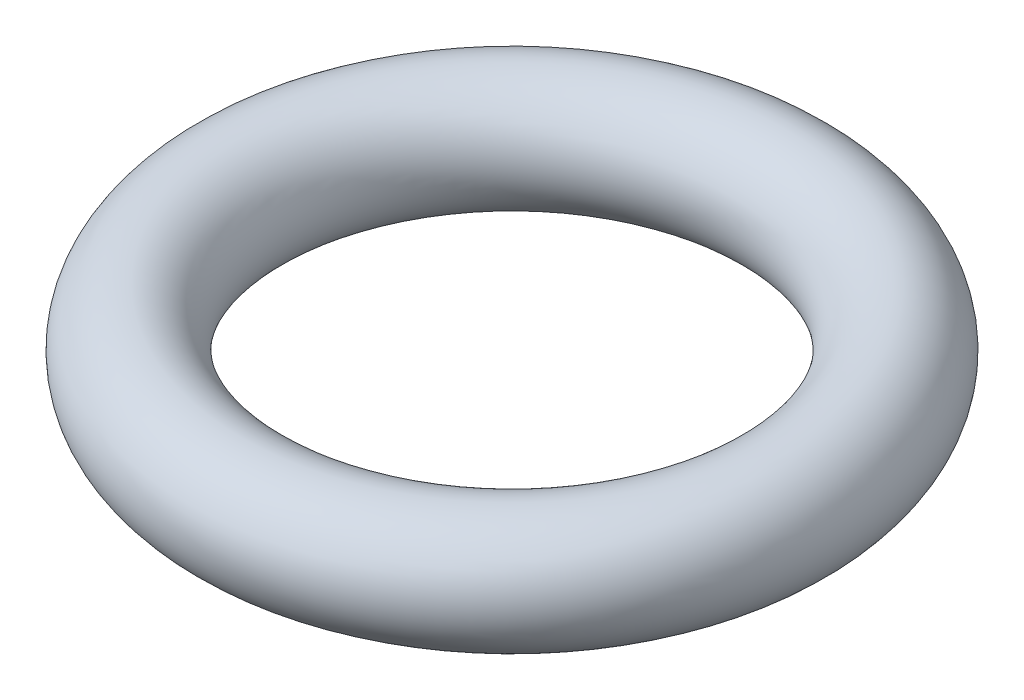
ISO-10303-21;
HEADER;
FILE_DESCRIPTION(('STEP AP214'),'2;1');
FILE_NAME('part.step','',(''),(''),'','','');
FILE_SCHEMA(('AUTOMOTIVE_DESIGN { 1 0 10303 214 1 1 1 1 }'));
ENDSEC;
DATA;
#1=APPLICATION_CONTEXT('core data for automotive mechanical design processes');
#2=APPLICATION_PROTOCOL_DEFINITION('international standard','automotive_design',2000,#1);
#3=PRODUCT_CONTEXT('',#1,'mechanical');
#4=PRODUCT('Part','Part','',(#3));
#5=PRODUCT_RELATED_PRODUCT_CATEGORY('part','',(#4));
#6=PRODUCT_DEFINITION_FORMATION('','',#4);
#7=PRODUCT_DEFINITION_CONTEXT('part definition',#1,'design');
#8=PRODUCT_DEFINITION('design','',#6,#7);
#9=PRODUCT_DEFINITION_SHAPE('','',#8);
#10=(LENGTH_UNIT() NAMED_UNIT(*) SI_UNIT(.MILLI.,.METRE.));
#11=(NAMED_UNIT(*) PLANE_ANGLE_UNIT() SI_UNIT($,.RADIAN.));
#12=(NAMED_UNIT(*) SI_UNIT($,.STERADIAN.) SOLID_ANGLE_UNIT());
#13=UNCERTAINTY_MEASURE_WITH_UNIT(LENGTH_MEASURE(1.E-05),#10,'distance_accuracy_value','');
#14=(GEOMETRIC_REPRESENTATION_CONTEXT(3) GLOBAL_UNCERTAINTY_ASSIGNED_CONTEXT((#13)) GLOBAL_UNIT_ASSIGNED_CONTEXT((#10,
#11,#12)) REPRESENTATION_CONTEXT('',''));
#15=CARTESIAN_POINT('',(0.,0.,0.));
#16=DIRECTION('',(0.,0.,1.));
#17=DIRECTION('',(1.,0.,0.));
#18=AXIS2_PLACEMENT_3D('',#15,#16,#17);
#19=CARTESIAN_POINT('',(0.,0.,0.));
#20=DIRECTION('',(0.,-1.,0.));
#21=DIRECTION('',(0.,0.,-1.));
#22=AXIS2_PLACEMENT_3D('',#19,#20,#21);
#23=TOROIDAL_SURFACE('',#22,13.1219484994901,2.81966852834835);
#24=CARTESIAN_POINT('',(0.,0.,-15.9416170278385));
#25=VERTEX_POINT('',#24);
#26=VERTEX_LOOP('',#25);
#27=FACE_BOUND('',#26,.T.);
#28=ADVANCED_FACE('F30',(#27),#23,.T.);
#29=CLOSED_SHELL('',(#28));
#30=MANIFOLD_SOLID_BREP('B2',#29);
#31=ADVANCED_BREP_SHAPE_REPRESENTATION('',(#18,#30),#14);
#32=SHAPE_DEFINITION_REPRESENTATION(#9,#31);
ENDSEC;
END-ISO-10303-21;
